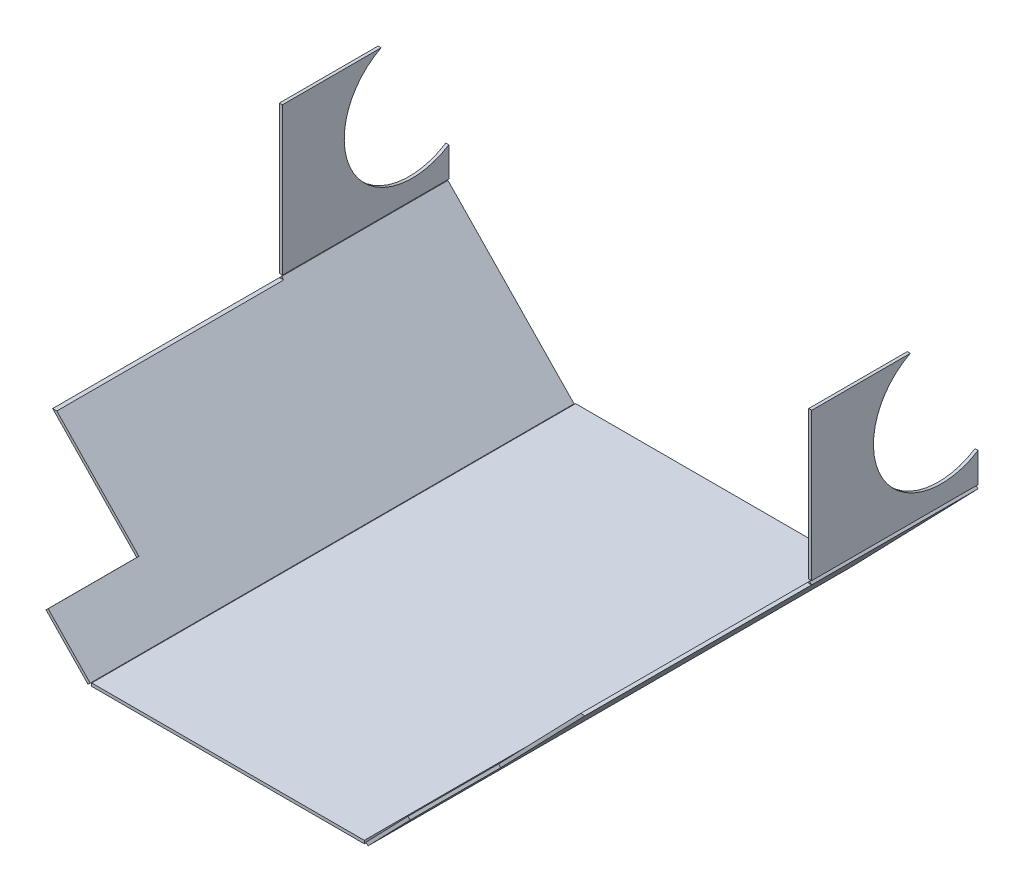
ISO-10303-21;
HEADER;
FILE_DESCRIPTION(('STEP AP214'),'2;1');
FILE_NAME('part.step','',(''),(''),'','','');
FILE_SCHEMA(('AUTOMOTIVE_DESIGN { 1 0 10303 214 1 1 1 1 }'));
ENDSEC;
DATA;
#1=APPLICATION_CONTEXT('core data for automotive mechanical design processes');
#2=APPLICATION_PROTOCOL_DEFINITION('international standard','automotive_design',2000,#1);
#3=PRODUCT_CONTEXT('',#1,'mechanical');
#4=PRODUCT('Part','Part','',(#3));
#5=PRODUCT_RELATED_PRODUCT_CATEGORY('part','',(#4));
#6=PRODUCT_DEFINITION_FORMATION('','',#4);
#7=PRODUCT_DEFINITION_CONTEXT('part definition',#1,'design');
#8=PRODUCT_DEFINITION('design','',#6,#7);
#9=PRODUCT_DEFINITION_SHAPE('','',#8);
#10=(LENGTH_UNIT() NAMED_UNIT(*) SI_UNIT(.MILLI.,.METRE.));
#11=(NAMED_UNIT(*) PLANE_ANGLE_UNIT() SI_UNIT($,.RADIAN.));
#12=(NAMED_UNIT(*) SI_UNIT($,.STERADIAN.) SOLID_ANGLE_UNIT());
#13=UNCERTAINTY_MEASURE_WITH_UNIT(LENGTH_MEASURE(1.E-05),#10,'distance_accuracy_value','');
#14=(GEOMETRIC_REPRESENTATION_CONTEXT(3) GLOBAL_UNCERTAINTY_ASSIGNED_CONTEXT((#13)) GLOBAL_UNIT_ASSIGNED_CONTEXT((#10,
#11,#12)) REPRESENTATION_CONTEXT('',''));
#15=CARTESIAN_POINT('',(0.,0.,0.));
#16=DIRECTION('',(0.,0.,1.));
#17=DIRECTION('',(1.,0.,0.));
#18=AXIS2_PLACEMENT_3D('',#15,#16,#17);
#19=CARTESIAN_POINT('',(0.,0.,0.));
#20=DIRECTION('',(0.,0.,1.));
#21=DIRECTION('',(1.,0.,0.));
#22=AXIS2_PLACEMENT_3D('',#19,#20,#21);
#23=PLANE('',#22);
#24=DIRECTION('',(0.,-1.,0.));
#25=VECTOR('',#24,1.);
#26=CARTESIAN_POINT('',(174.,100.,0.));
#27=LINE('',#26,#25);
#28=CARTESIAN_POINT('',(174.,22.0292546820582,0.));
#29=VERTEX_POINT('',#28);
#30=CARTESIAN_POINT('',(174.,2.39051798994287,0.));
#31=VERTEX_POINT('',#30);
#32=EDGE_CURVE('E103',#29,#31,#27,.T.);
#33=ORIENTED_EDGE('',*,*,#32,.F.);
#34=DIRECTION('',(1.,0.,0.));
#35=VECTOR('',#34,1.);
#36=CARTESIAN_POINT('',(-176.,22.029254682058,0.));
#37=LINE('',#36,#35);
#38=CARTESIAN_POINT('',(176.,22.0292546820582,0.));
#39=VERTEX_POINT('',#38);
#40=EDGE_CURVE('E93',#29,#39,#37,.T.);
#41=ORIENTED_EDGE('',*,*,#40,.T.);
#42=DIRECTION('',(0.,1.,0.));
#43=VECTOR('',#42,1.);
#44=CARTESIAN_POINT('',(176.,100.,0.));
#45=LINE('',#44,#43);
#46=CARTESIAN_POINT('',(176.,2.39051798994287,0.));
#47=VERTEX_POINT('',#46);
#48=EDGE_CURVE('E102',#47,#39,#45,.T.);
#49=ORIENTED_EDGE('',*,*,#48,.F.);
#50=DIRECTION('',(1.,0.,0.));
#51=VECTOR('',#50,1.);
#52=CARTESIAN_POINT('',(176.,2.39051798994287,0.));
#53=LINE('',#52,#51);
#54=EDGE_CURVE('E111',#31,#47,#53,.T.);
#55=ORIENTED_EDGE('',*,*,#54,.F.);
#56=EDGE_LOOP('',(#33,#41,#49,#55));
#57=FACE_BOUND('',#56,.T.);
#58=ADVANCED_FACE('F51',(#57),#23,.F.);
#59=CARTESIAN_POINT('',(176.,100.,320.));
#60=DIRECTION('',(0.,-1.,0.));
#61=DIRECTION('',(0.,0.,-1.));
#62=AXIS2_PLACEMENT_3D('',#59,#60,#61);
#63=PLANE('',#62);
#64=DIRECTION('',(0.,0.,-1.));
#65=VECTOR('',#64,1.);
#66=CARTESIAN_POINT('',(176.,100.,320.));
#67=LINE('',#66,#65);
#68=CARTESIAN_POINT('',(176.,100.,110.));
#69=VERTEX_POINT('',#68);
#70=CARTESIAN_POINT('',(176.,100.,44.7655281280883));
#71=VERTEX_POINT('',#70);
#72=EDGE_CURVE('E104',#69,#71,#67,.T.);
#73=ORIENTED_EDGE('',*,*,#72,.T.);
#74=DIRECTION('',(1.,0.,0.));
#75=VECTOR('',#74,1.);
#76=CARTESIAN_POINT('',(-176.,100.,44.7655281280879));
#77=LINE('',#76,#75);
#78=CARTESIAN_POINT('',(174.,100.,44.7655281280883));
#79=VERTEX_POINT('',#78);
#80=EDGE_CURVE('E65',#71,#79,#77,.F.);
#81=ORIENTED_EDGE('',*,*,#80,.T.);
#82=DIRECTION('',(0.,0.,-1.));
#83=VECTOR('',#82,1.);
#84=CARTESIAN_POINT('',(174.,100.,320.));
#85=LINE('',#84,#83);
#86=CARTESIAN_POINT('',(174.,100.,110.));
#87=VERTEX_POINT('',#86);
#88=EDGE_CURVE('E120',#87,#79,#85,.T.);
#89=ORIENTED_EDGE('',*,*,#88,.F.);
#90=DIRECTION('',(1.,0.,0.));
#91=VECTOR('',#90,1.);
#92=CARTESIAN_POINT('',(-176.,100.,110.));
#93=LINE('',#92,#91);
#94=EDGE_CURVE('E122',#87,#69,#93,.T.);
#95=ORIENTED_EDGE('',*,*,#94,.T.);
#96=EDGE_LOOP('',(#73,#81,#89,#95));
#97=FACE_BOUND('',#96,.T.);
#98=ADVANCED_FACE('F138',(#97),#63,.F.);
#99=CARTESIAN_POINT('',(174.,100.,320.));
#100=DIRECTION('',(1.,0.,0.));
#101=DIRECTION('',(0.,0.,-1.));
#102=AXIS2_PLACEMENT_3D('',#99,#100,#101);
#103=PLANE('',#102);
#104=ORIENTED_EDGE('',*,*,#88,.T.);
#105=CARTESIAN_POINT('',(174.,60.,24.15));
#106=DIRECTION('',(1.,0.,0.));
#107=DIRECTION('',(0.,0.,-1.));
#108=AXIS2_PLACEMENT_3D('',#105,#106,#107);
#109=CIRCLE('',#108,45.);
#110=EDGE_CURVE('E71',#79,#29,#109,.T.);
#111=ORIENTED_EDGE('',*,*,#110,.T.);
#112=ORIENTED_EDGE('',*,*,#32,.T.);
#113=DIRECTION('',(0.,0.,-1.));
#114=VECTOR('',#113,1.);
#115=CARTESIAN_POINT('',(174.,2.39051798994287,320.));
#116=LINE('',#115,#114);
#117=CARTESIAN_POINT('',(174.,2.39051798994287,110.));
#118=VERTEX_POINT('',#117);
#119=EDGE_CURVE('E114',#118,#31,#116,.T.);
#120=ORIENTED_EDGE('',*,*,#119,.F.);
#121=DIRECTION('',(0.,1.,0.));
#122=VECTOR('',#121,1.);
#123=CARTESIAN_POINT('',(174.,99.9999999999999,110.));
#124=LINE('',#123,#122);
#125=EDGE_CURVE('E124',#118,#87,#124,.T.);
#126=ORIENTED_EDGE('',*,*,#125,.T.);
#127=EDGE_LOOP('',(#104,#111,#112,#120,#126));
#128=FACE_BOUND('',#127,.T.);
#129=ADVANCED_FACE('F139',(#128),#103,.F.);
#130=CARTESIAN_POINT('',(176.,2.39051798994287,320.));
#131=DIRECTION('',(0.,1.,0.));
#132=DIRECTION('',(-1.,0.,0.));
#133=AXIS2_PLACEMENT_3D('',#130,#131,#132);
#134=PLANE('',#133);
#135=DIRECTION('',(0.,0.,-1.));
#136=VECTOR('',#135,1.);
#137=CARTESIAN_POINT('',(176.,2.39051798994287,320.));
#138=LINE('',#137,#136);
#139=CARTESIAN_POINT('',(176.,2.39051798994287,110.));
#140=VERTEX_POINT('',#139);
#141=EDGE_CURVE('E109',#140,#47,#138,.T.);
#142=ORIENTED_EDGE('',*,*,#141,.F.);
#143=DIRECTION('',(-1.,0.,0.));
#144=VECTOR('',#143,1.);
#145=CARTESIAN_POINT('',(176.,2.39051798994287,110.));
#146=LINE('',#145,#144);
#147=EDGE_CURVE('E128',#140,#118,#146,.T.);
#148=ORIENTED_EDGE('',*,*,#147,.T.);
#149=ORIENTED_EDGE('',*,*,#119,.T.);
#150=ORIENTED_EDGE('',*,*,#54,.T.);
#151=EDGE_LOOP('',(#142,#148,#149,#150));
#152=FACE_BOUND('',#151,.T.);
#153=ADVANCED_FACE('F141',(#152),#134,.F.);
#154=CARTESIAN_POINT('',(176.,100.,320.));
#155=DIRECTION('',(-1.,0.,0.));
#156=DIRECTION('',(0.,-1.,0.));
#157=AXIS2_PLACEMENT_3D('',#154,#155,#156);
#158=PLANE('',#157);
#159=ORIENTED_EDGE('',*,*,#48,.T.);
#160=CARTESIAN_POINT('',(176.,60.,24.15));
#161=DIRECTION('',(1.,0.,0.));
#162=DIRECTION('',(0.,1.,0.));
#163=AXIS2_PLACEMENT_3D('',#160,#161,#162);
#164=CIRCLE('',#163,45.);
#165=EDGE_CURVE('E12',#71,#39,#164,.T.);
#166=ORIENTED_EDGE('',*,*,#165,.F.);
#167=ORIENTED_EDGE('',*,*,#72,.F.);
#168=DIRECTION('',(0.,1.,0.));
#169=VECTOR('',#168,1.);
#170=CARTESIAN_POINT('',(176.,100.,110.));
#171=LINE('',#170,#169);
#172=EDGE_CURVE('E59',#140,#69,#171,.T.);
#173=ORIENTED_EDGE('',*,*,#172,.F.);
#174=ORIENTED_EDGE('',*,*,#141,.T.);
#175=EDGE_LOOP('',(#159,#166,#167,#173,#174));
#176=FACE_BOUND('',#175,.T.);
#177=ADVANCED_FACE('F106',(#176),#158,.F.);
#178=CARTESIAN_POINT('',(-176.,100.,110.));
#179=DIRECTION('',(0.,0.,-1.));
#180=DIRECTION('',(0.,1.,0.));
#181=AXIS2_PLACEMENT_3D('',#178,#179,#180);
#182=PLANE('',#181);
#183=ORIENTED_EDGE('',*,*,#147,.F.);
#184=ORIENTED_EDGE('',*,*,#172,.T.);
#185=ORIENTED_EDGE('',*,*,#94,.F.);
#186=ORIENTED_EDGE('',*,*,#125,.F.);
#187=EDGE_LOOP('',(#183,#184,#185,#186));
#188=FACE_BOUND('',#187,.T.);
#189=ADVANCED_FACE('F153',(#188),#182,.F.);
#190=CARTESIAN_POINT('',(-176.,59.9999999999998,24.15));
#191=DIRECTION('',(1.,0.,0.));
#192=DIRECTION('',(0.,1.,0.));
#193=AXIS2_PLACEMENT_3D('',#190,#191,#192);
#194=CYLINDRICAL_SURFACE('',#193,45.);
#195=ORIENTED_EDGE('',*,*,#165,.T.);
#196=ORIENTED_EDGE('',*,*,#40,.F.);
#197=ORIENTED_EDGE('',*,*,#110,.F.);
#198=ORIENTED_EDGE('',*,*,#80,.F.);
#199=EDGE_LOOP('',(#195,#196,#197,#198));
#200=FACE_BOUND('',#199,.T.);
#201=ADVANCED_FACE('F53',(#200),#194,.F.);
#202=CLOSED_SHELL('',(#58,#98,#129,#153,#177,#189,#201));
#203=MANIFOLD_SOLID_BREP('B2',#202);
#204=CARTESIAN_POINT('',(-176.,100.,320.));
#205=DIRECTION('',(1.,0.,0.));
#206=DIRECTION('',(0.,0.,-1.));
#207=AXIS2_PLACEMENT_3D('',#204,#205,#206);
#208=PLANE('',#207);
#209=DIRECTION('',(0.,0.,-1.));
#210=VECTOR('',#209,1.);
#211=CARTESIAN_POINT('',(-176.,100.,320.));
#212=LINE('',#211,#210);
#213=CARTESIAN_POINT('',(-176.,100.,110.));
#214=VERTEX_POINT('',#213);
#215=CARTESIAN_POINT('',(-176.,100.,44.7655281280879));
#216=VERTEX_POINT('',#215);
#217=EDGE_CURVE('E291',#214,#216,#212,.T.);
#218=ORIENTED_EDGE('',*,*,#217,.T.);
#219=CARTESIAN_POINT('',(-176.,59.9999999999998,24.15));
#220=DIRECTION('',(1.,0.,0.));
#221=DIRECTION('',(0.,1.,0.));
#222=AXIS2_PLACEMENT_3D('',#219,#220,#221);
#223=CIRCLE('',#222,45.);
#224=CARTESIAN_POINT('',(-176.,22.029254682058,0.));
#225=VERTEX_POINT('',#224);
#226=EDGE_CURVE('E235',#216,#225,#223,.T.);
#227=ORIENTED_EDGE('',*,*,#226,.T.);
#228=DIRECTION('',(0.,-1.,0.));
#229=VECTOR('',#228,1.);
#230=CARTESIAN_POINT('',(-176.,100.,0.));
#231=LINE('',#230,#229);
#232=CARTESIAN_POINT('',(-176.,2.39051798994287,0.));
#233=VERTEX_POINT('',#232);
#234=EDGE_CURVE('E295',#225,#233,#231,.T.);
#235=ORIENTED_EDGE('',*,*,#234,.T.);
#236=DIRECTION('',(0.,0.,-1.));
#237=VECTOR('',#236,1.);
#238=CARTESIAN_POINT('',(-176.,2.39051798994287,320.));
#239=LINE('',#238,#237);
#240=CARTESIAN_POINT('',(-176.,2.3905179899429,110.));
#241=VERTEX_POINT('',#240);
#242=EDGE_CURVE('E293',#241,#233,#239,.T.);
#243=ORIENTED_EDGE('',*,*,#242,.F.);
#244=DIRECTION('',(0.,1.,0.));
#245=VECTOR('',#244,1.);
#246=CARTESIAN_POINT('',(-176.,100.,110.));
#247=LINE('',#246,#245);
#248=EDGE_CURVE('E277',#241,#214,#247,.T.);
#249=ORIENTED_EDGE('',*,*,#248,.T.);
#250=EDGE_LOOP('',(#218,#227,#235,#243,#249));
#251=FACE_BOUND('',#250,.T.);
#252=ADVANCED_FACE('F231',(#251),#208,.F.);
#253=CARTESIAN_POINT('',(-174.,2.39051798994287,320.));
#254=DIRECTION('',(0.,1.,0.));
#255=DIRECTION('',(-1.,0.,0.));
#256=AXIS2_PLACEMENT_3D('',#253,#254,#255);
#257=PLANE('',#256);
#258=DIRECTION('',(0.,0.,-1.));
#259=VECTOR('',#258,1.);
#260=CARTESIAN_POINT('',(-174.,2.39051798994287,320.));
#261=LINE('',#260,#259);
#262=CARTESIAN_POINT('',(-174.,2.39051798994287,110.));
#263=VERTEX_POINT('',#262);
#264=CARTESIAN_POINT('',(-174.,2.39051798994287,0.));
#265=VERTEX_POINT('',#264);
#266=EDGE_CURVE('E308',#263,#265,#261,.T.);
#267=ORIENTED_EDGE('',*,*,#266,.F.);
#268=DIRECTION('',(-1.,0.,0.));
#269=VECTOR('',#268,1.);
#270=CARTESIAN_POINT('',(-174.,2.39051798994287,110.));
#271=LINE('',#270,#269);
#272=EDGE_CURVE('E294',#263,#241,#271,.T.);
#273=ORIENTED_EDGE('',*,*,#272,.T.);
#274=ORIENTED_EDGE('',*,*,#242,.T.);
#275=DIRECTION('',(1.,0.,0.));
#276=VECTOR('',#275,1.);
#277=CARTESIAN_POINT('',(-174.,2.39051798994287,0.));
#278=LINE('',#277,#276);
#279=EDGE_CURVE('E306',#233,#265,#278,.T.);
#280=ORIENTED_EDGE('',*,*,#279,.T.);
#281=EDGE_LOOP('',(#267,#273,#274,#280));
#282=FACE_BOUND('',#281,.T.);
#283=ADVANCED_FACE('F317',(#282),#257,.F.);
#284=CARTESIAN_POINT('',(-174.,100.,320.));
#285=DIRECTION('',(-1.,0.,0.));
#286=DIRECTION('',(0.,0.,1.));
#287=AXIS2_PLACEMENT_3D('',#284,#285,#286);
#288=PLANE('',#287);
#289=DIRECTION('',(0.,1.,0.));
#290=VECTOR('',#289,1.);
#291=CARTESIAN_POINT('',(-174.,100.,0.));
#292=LINE('',#291,#290);
#293=CARTESIAN_POINT('',(-174.,22.029254682058,0.));
#294=VERTEX_POINT('',#293);
#295=EDGE_CURVE('E303',#265,#294,#292,.T.);
#296=ORIENTED_EDGE('',*,*,#295,.T.);
#297=CARTESIAN_POINT('',(-174.,59.9999999999998,24.15));
#298=DIRECTION('',(-1.,0.,0.));
#299=DIRECTION('',(0.,0.,1.));
#300=AXIS2_PLACEMENT_3D('',#297,#298,#299);
#301=CIRCLE('',#300,45.);
#302=CARTESIAN_POINT('',(-174.,100.,44.7655281280879));
#303=VERTEX_POINT('',#302);
#304=EDGE_CURVE('E260',#294,#303,#301,.T.);
#305=ORIENTED_EDGE('',*,*,#304,.T.);
#306=DIRECTION('',(0.,0.,-1.));
#307=VECTOR('',#306,1.);
#308=CARTESIAN_POINT('',(-174.,100.,320.));
#309=LINE('',#308,#307);
#310=CARTESIAN_POINT('',(-174.,100.,110.));
#311=VERTEX_POINT('',#310);
#312=EDGE_CURVE('E301',#311,#303,#309,.T.);
#313=ORIENTED_EDGE('',*,*,#312,.F.);
#314=DIRECTION('',(0.,-1.,0.));
#315=VECTOR('',#314,1.);
#316=CARTESIAN_POINT('',(-174.,99.9999999999999,110.));
#317=LINE('',#316,#315);
#318=EDGE_CURVE('E282',#311,#263,#317,.T.);
#319=ORIENTED_EDGE('',*,*,#318,.T.);
#320=ORIENTED_EDGE('',*,*,#266,.T.);
#321=EDGE_LOOP('',(#296,#305,#313,#319,#320));
#322=FACE_BOUND('',#321,.T.);
#323=ADVANCED_FACE('F314',(#322),#288,.F.);
#324=CARTESIAN_POINT('',(-176.,100.,320.));
#325=DIRECTION('',(0.,-1.,0.));
#326=DIRECTION('',(0.,0.,-1.));
#327=AXIS2_PLACEMENT_3D('',#324,#325,#326);
#328=PLANE('',#327);
#329=ORIENTED_EDGE('',*,*,#312,.T.);
#330=DIRECTION('',(1.,0.,0.));
#331=VECTOR('',#330,1.);
#332=CARTESIAN_POINT('',(-176.,100.,44.7655281280879));
#333=LINE('',#332,#331);
#334=EDGE_CURVE('E249',#303,#216,#333,.F.);
#335=ORIENTED_EDGE('',*,*,#334,.T.);
#336=ORIENTED_EDGE('',*,*,#217,.F.);
#337=DIRECTION('',(1.,0.,0.));
#338=VECTOR('',#337,1.);
#339=CARTESIAN_POINT('',(-176.,100.,110.));
#340=LINE('',#339,#338);
#341=EDGE_CURVE('E241',#214,#311,#340,.T.);
#342=ORIENTED_EDGE('',*,*,#341,.T.);
#343=EDGE_LOOP('',(#329,#335,#336,#342));
#344=FACE_BOUND('',#343,.T.);
#345=ADVANCED_FACE('F297',(#344),#328,.F.);
#346=CARTESIAN_POINT('',(0.,0.,0.));
#347=DIRECTION('',(0.,0.,-1.));
#348=DIRECTION('',(-1.,0.,0.));
#349=AXIS2_PLACEMENT_3D('',#346,#347,#348);
#350=PLANE('',#349);
#351=DIRECTION('',(1.,0.,0.));
#352=VECTOR('',#351,1.);
#353=CARTESIAN_POINT('',(-176.,22.029254682058,0.));
#354=LINE('',#353,#352);
#355=EDGE_CURVE('E49',#294,#225,#354,.F.);
#356=ORIENTED_EDGE('',*,*,#355,.F.);
#357=ORIENTED_EDGE('',*,*,#295,.F.);
#358=ORIENTED_EDGE('',*,*,#279,.F.);
#359=ORIENTED_EDGE('',*,*,#234,.F.);
#360=EDGE_LOOP('',(#356,#357,#358,#359));
#361=FACE_BOUND('',#360,.T.);
#362=ADVANCED_FACE('F322',(#361),#350,.T.);
#363=CARTESIAN_POINT('',(-176.,100.,110.));
#364=DIRECTION('',(0.,0.,-1.));
#365=DIRECTION('',(0.,1.,0.));
#366=AXIS2_PLACEMENT_3D('',#363,#364,#365);
#367=PLANE('',#366);
#368=ORIENTED_EDGE('',*,*,#318,.F.);
#369=ORIENTED_EDGE('',*,*,#341,.F.);
#370=ORIENTED_EDGE('',*,*,#248,.F.);
#371=ORIENTED_EDGE('',*,*,#272,.F.);
#372=EDGE_LOOP('',(#368,#369,#370,#371));
#373=FACE_BOUND('',#372,.T.);
#374=ADVANCED_FACE('F280',(#373),#367,.F.);
#375=CARTESIAN_POINT('',(-176.,59.9999999999998,24.15));
#376=DIRECTION('',(1.,0.,0.));
#377=DIRECTION('',(0.,1.,0.));
#378=AXIS2_PLACEMENT_3D('',#375,#376,#377);
#379=CYLINDRICAL_SURFACE('',#378,45.);
#380=ORIENTED_EDGE('',*,*,#304,.F.);
#381=ORIENTED_EDGE('',*,*,#355,.T.);
#382=ORIENTED_EDGE('',*,*,#226,.F.);
#383=ORIENTED_EDGE('',*,*,#334,.F.);
#384=EDGE_LOOP('',(#380,#381,#382,#383));
#385=FACE_BOUND('',#384,.T.);
#386=ADVANCED_FACE('F233',(#385),#379,.F.);
#387=CLOSED_SHELL('',(#252,#283,#323,#345,#362,#374,#386));
#388=MANIFOLD_SOLID_BREP('B6',#387);
#389=CARTESIAN_POINT('',(92.57,-86.25,320.));
#390=DIRECTION('',(0.695258994971437,0.718759299008582,0.));
#391=DIRECTION('',(-0.718759299008582,0.695258994971437,0.));
#392=AXIS2_PLACEMENT_3D('',#389,#390,#391);
#393=PLANE('',#392);
#394=DIRECTION('',(0.718759299008582,-0.695258994971437,0.));
#395=VECTOR('',#394,1.);
#396=CARTESIAN_POINT('',(92.57,-86.25,0.));
#397=LINE('',#396,#395);
#398=CARTESIAN_POINT('',(91.1324814019829,-84.8594820100571,0.));
#399=VERTEX_POINT('',#398);
#400=CARTESIAN_POINT('',(92.57,-86.25,0.));
#401=VERTEX_POINT('',#400);
#402=EDGE_CURVE('E507',#399,#401,#397,.T.);
#403=ORIENTED_EDGE('',*,*,#402,.T.);
#404=DIRECTION('',(0.,0.,-1.));
#405=VECTOR('',#404,1.);
#406=CARTESIAN_POINT('',(92.57,-86.25,320.));
#407=LINE('',#406,#405);
#408=CARTESIAN_POINT('',(92.57,-86.25,320.));
#409=VERTEX_POINT('',#408);
#410=EDGE_CURVE('E524',#409,#401,#407,.T.);
#411=ORIENTED_EDGE('',*,*,#410,.F.);
#412=DIRECTION('',(0.718759299008582,-0.695258994971437,0.));
#413=VECTOR('',#412,1.);
#414=CARTESIAN_POINT('',(92.57,-86.25,320.));
#415=LINE('',#414,#413);
#416=CARTESIAN_POINT('',(91.1324814019829,-84.8594820100571,320.));
#417=VERTEX_POINT('',#416);
#418=EDGE_CURVE('E498',#417,#409,#415,.T.);
#419=ORIENTED_EDGE('',*,*,#418,.F.);
#420=DIRECTION('',(0.,0.,-1.));
#421=VECTOR('',#420,1.);
#422=CARTESIAN_POINT('',(91.1324814019829,-84.8594820100571,320.));
#423=LINE('',#422,#421);
#424=EDGE_CURVE('E503',#417,#399,#423,.T.);
#425=ORIENTED_EDGE('',*,*,#424,.T.);
#426=EDGE_LOOP('',(#403,#411,#419,#425));
#427=FACE_BOUND('',#426,.T.);
#428=ADVANCED_FACE('F411',(#427),#393,.F.);
#429=CARTESIAN_POINT('',(92.57,-86.25,320.));
#430=DIRECTION('',(-0.718759299008584,0.695258994971434,0.));
#431=DIRECTION('',(-0.695258994971434,-0.718759299008584,0.));
#432=AXIS2_PLACEMENT_3D('',#429,#430,#431);
#433=PLANE('',#432);
#434=DIRECTION('',(0.,0.,-1.));
#435=VECTOR('',#434,1.);
#436=CARTESIAN_POINT('',(176.,0.,320.));
#437=LINE('',#436,#435);
#438=CARTESIAN_POINT('',(176.,0.,260.));
#439=VERTEX_POINT('',#438);
#440=CARTESIAN_POINT('',(176.,0.,110.));
#441=VERTEX_POINT('',#440);
#442=EDGE_CURVE('E521',#439,#441,#437,.T.);
#443=ORIENTED_EDGE('',*,*,#442,.F.);
#444=DIRECTION('',(0.695258994971434,0.718759299008584,0.));
#445=VECTOR('',#444,1.);
#446=CARTESIAN_POINT('',(176.,0.,260.));
#447=LINE('',#446,#445);
#448=CARTESIAN_POINT('',(120.379280402285,-57.5007439206868,260.));
#449=VERTEX_POINT('',#448);
#450=EDGE_CURVE('E426',#449,#439,#447,.T.);
#451=ORIENTED_EDGE('',*,*,#450,.F.);
#452=DIRECTION('',(0.,0.,-1.));
#453=VECTOR('',#452,1.);
#454=CARTESIAN_POINT('',(120.379280402285,-57.5007439206868,320.));
#455=LINE('',#454,#453);
#456=CARTESIAN_POINT('',(120.379280402285,-57.5007439206868,320.));
#457=VERTEX_POINT('',#456);
#458=EDGE_CURVE('E487',#457,#449,#455,.T.);
#459=ORIENTED_EDGE('',*,*,#458,.F.);
#460=DIRECTION('',(0.695258994971434,0.718759299008584,0.));
#461=VECTOR('',#460,1.);
#462=CARTESIAN_POINT('',(92.57,-86.25,320.));
#463=LINE('',#462,#461);
#464=EDGE_CURVE('E450',#409,#457,#463,.T.);
#465=ORIENTED_EDGE('',*,*,#464,.F.);
#466=ORIENTED_EDGE('',*,*,#410,.T.);
#467=DIRECTION('',(0.695258994971434,0.718759299008584,0.));
#468=VECTOR('',#467,1.);
#469=CARTESIAN_POINT('',(92.57,-86.25,0.));
#470=LINE('',#469,#468);
#471=CARTESIAN_POINT('',(176.,0.,0.));
#472=VERTEX_POINT('',#471);
#473=EDGE_CURVE('E434',#401,#472,#470,.T.);
#474=ORIENTED_EDGE('',*,*,#473,.T.);
#475=EDGE_CURVE('E523',#441,#472,#437,.T.);
#476=ORIENTED_EDGE('',*,*,#475,.F.);
#477=EDGE_LOOP('',(#443,#451,#459,#465,#466,#474,#476));
#478=FACE_BOUND('',#477,.T.);
#479=ADVANCED_FACE('F495',(#478),#433,.F.);
#480=CARTESIAN_POINT('',(176.,0.,320.));
#481=DIRECTION('',(-0.695258994971433,-0.718759299008586,0.));
#482=DIRECTION('',(0.718759299008586,-0.695258994971433,0.));
#483=AXIS2_PLACEMENT_3D('',#480,#481,#482);
#484=PLANE('',#483);
#485=DIRECTION('',(0.,0.,-1.));
#486=VECTOR('',#485,1.);
#487=CARTESIAN_POINT('',(174.562481401983,1.39051798994287,320.));
#488=LINE('',#487,#486);
#489=CARTESIAN_POINT('',(174.562481401983,1.39051798994287,110.));
#490=VERTEX_POINT('',#489);
#491=CARTESIAN_POINT('',(174.562481401983,1.39051798994287,0.));
#492=VERTEX_POINT('',#491);
#493=EDGE_CURVE('E519',#490,#492,#488,.T.);
#494=ORIENTED_EDGE('',*,*,#493,.F.);
#495=DIRECTION('',(0.718759299008586,-0.695258994971433,0.));
#496=VECTOR('',#495,1.);
#497=CARTESIAN_POINT('',(176.,0.,110.));
#498=LINE('',#497,#496);
#499=EDGE_CURVE('E526',#490,#441,#498,.T.);
#500=ORIENTED_EDGE('',*,*,#499,.T.);
#501=ORIENTED_EDGE('',*,*,#475,.T.);
#502=DIRECTION('',(-0.718759299008586,0.695258994971433,0.));
#503=VECTOR('',#502,1.);
#504=CARTESIAN_POINT('',(176.,0.,0.));
#505=LINE('',#504,#503);
#506=EDGE_CURVE('E512',#472,#492,#505,.T.);
#507=ORIENTED_EDGE('',*,*,#506,.T.);
#508=EDGE_LOOP('',(#494,#500,#501,#507));
#509=FACE_BOUND('',#508,.T.);
#510=ADVANCED_FACE('F545',(#509),#484,.F.);
#511=CARTESIAN_POINT('',(91.1324814019829,-84.8594820100571,320.));
#512=DIRECTION('',(0.718759299008584,-0.695258994971434,0.));
#513=DIRECTION('',(0.695258994971434,0.718759299008584,0.));
#514=AXIS2_PLACEMENT_3D('',#511,#512,#513);
#515=PLANE('',#514);
#516=DIRECTION('',(0.,0.,-1.));
#517=VECTOR('',#516,1.);
#518=CARTESIAN_POINT('',(118.941761804268,-56.1102259307439,320.));
#519=LINE('',#518,#517);
#520=CARTESIAN_POINT('',(118.941761804268,-56.1102259307439,320.));
#521=VERTEX_POINT('',#520);
#522=CARTESIAN_POINT('',(118.941761804268,-56.1102259307439,260.));
#523=VERTEX_POINT('',#522);
#524=EDGE_CURVE('E489',#521,#523,#519,.T.);
#525=ORIENTED_EDGE('',*,*,#524,.T.);
#526=DIRECTION('',(0.695258994971434,0.718759299008584,0.));
#527=VECTOR('',#526,1.);
#528=CARTESIAN_POINT('',(91.1324814019829,-84.8594820100571,260.));
#529=LINE('',#528,#527);
#530=CARTESIAN_POINT('',(173.217427304581,0.,260.));
#531=VERTEX_POINT('',#530);
#532=EDGE_CURVE('E535',#523,#531,#529,.T.);
#533=ORIENTED_EDGE('',*,*,#532,.T.);
#534=DIRECTION('',(0.,0.,-1.));
#535=VECTOR('',#534,1.);
#536=CARTESIAN_POINT('',(173.217427304581,0.,320.));
#537=LINE('',#536,#535);
#538=CARTESIAN_POINT('',(173.217427304581,0.,110.));
#539=VERTEX_POINT('',#538);
#540=EDGE_CURVE('E529',#531,#539,#537,.T.);
#541=ORIENTED_EDGE('',*,*,#540,.T.);
#542=DIRECTION('',(0.695258994971434,0.718759299008584,0.));
#543=VECTOR('',#542,1.);
#544=CARTESIAN_POINT('',(91.1324814019829,-84.8594820100571,110.));
#545=LINE('',#544,#543);
#546=EDGE_CURVE('E419',#539,#490,#545,.T.);
#547=ORIENTED_EDGE('',*,*,#546,.T.);
#548=ORIENTED_EDGE('',*,*,#493,.T.);
#549=DIRECTION('',(-0.695258994971434,-0.718759299008584,0.));
#550=VECTOR('',#549,1.);
#551=CARTESIAN_POINT('',(91.1324814019829,-84.8594820100571,0.));
#552=LINE('',#551,#550);
#553=EDGE_CURVE('E458',#492,#399,#552,.T.);
#554=ORIENTED_EDGE('',*,*,#553,.T.);
#555=ORIENTED_EDGE('',*,*,#424,.F.);
#556=DIRECTION('',(-0.695258994971434,-0.718759299008584,0.));
#557=VECTOR('',#556,1.);
#558=CARTESIAN_POINT('',(91.1324814019829,-84.8594820100571,320.));
#559=LINE('',#558,#557);
#560=EDGE_CURVE('E500',#521,#417,#559,.T.);
#561=ORIENTED_EDGE('',*,*,#560,.F.);
#562=EDGE_LOOP('',(#525,#533,#541,#547,#548,#554,#555,#561));
#563=FACE_BOUND('',#562,.T.);
#564=ADVANCED_FACE('F540',(#563),#515,.F.);
#565=CARTESIAN_POINT('',(0.,0.,320.));
#566=DIRECTION('',(0.,0.,-1.));
#567=DIRECTION('',(-1.,0.,0.));
#568=AXIS2_PLACEMENT_3D('',#565,#566,#567);
#569=PLANE('',#568);
#570=ORIENTED_EDGE('',*,*,#464,.T.);
#571=DIRECTION('',(0.718759299008584,-0.695258994971434,0.));
#572=VECTOR('',#571,1.);
#573=CARTESIAN_POINT('',(-111.441561712004,166.740564573171,320.));
#574=LINE('',#573,#572);
#575=EDGE_CURVE('E484',#521,#457,#574,.T.);
#576=ORIENTED_EDGE('',*,*,#575,.F.);
#577=ORIENTED_EDGE('',*,*,#560,.T.);
#578=ORIENTED_EDGE('',*,*,#418,.T.);
#579=EDGE_LOOP('',(#570,#576,#577,#578));
#580=FACE_BOUND('',#579,.T.);
#581=ADVANCED_FACE('F413',(#580),#569,.F.);
#582=CARTESIAN_POINT('',(0.,0.,0.));
#583=DIRECTION('',(0.,0.,-1.));
#584=DIRECTION('',(-1.,0.,0.));
#585=AXIS2_PLACEMENT_3D('',#582,#583,#584);
#586=PLANE('',#585);
#587=ORIENTED_EDGE('',*,*,#402,.F.);
#588=ORIENTED_EDGE('',*,*,#553,.F.);
#589=ORIENTED_EDGE('',*,*,#506,.F.);
#590=ORIENTED_EDGE('',*,*,#473,.F.);
#591=EDGE_LOOP('',(#587,#588,#589,#590));
#592=FACE_BOUND('',#591,.T.);
#593=ADVANCED_FACE('F543',(#592),#586,.T.);
#594=CARTESIAN_POINT('',(-176.,100.,110.));
#595=DIRECTION('',(0.,0.,-1.));
#596=DIRECTION('',(0.,1.,0.));
#597=AXIS2_PLACEMENT_3D('',#594,#595,#596);
#598=PLANE('',#597);
#599=ORIENTED_EDGE('',*,*,#546,.F.);
#600=DIRECTION('',(1.,0.,0.));
#601=VECTOR('',#600,1.);
#602=CARTESIAN_POINT('',(-176.,0.,110.));
#603=LINE('',#602,#601);
#604=EDGE_CURVE('E531',#539,#441,#603,.T.);
#605=ORIENTED_EDGE('',*,*,#604,.T.);
#606=ORIENTED_EDGE('',*,*,#499,.F.);
#607=EDGE_LOOP('',(#599,#605,#606));
#608=FACE_BOUND('',#607,.T.);
#609=ADVANCED_FACE('F547',(#608),#598,.F.);
#610=CARTESIAN_POINT('',(-176.,0.,110.));
#611=DIRECTION('',(0.,-1.,0.));
#612=DIRECTION('',(0.,0.,-1.));
#613=AXIS2_PLACEMENT_3D('',#610,#611,#612);
#614=PLANE('',#613);
#615=ORIENTED_EDGE('',*,*,#540,.F.);
#616=DIRECTION('',(1.,0.,0.));
#617=VECTOR('',#616,1.);
#618=CARTESIAN_POINT('',(-176.,0.,260.));
#619=LINE('',#618,#617);
#620=EDGE_CURVE('E229',#531,#439,#619,.T.);
#621=ORIENTED_EDGE('',*,*,#620,.T.);
#622=ORIENTED_EDGE('',*,*,#442,.T.);
#623=ORIENTED_EDGE('',*,*,#604,.F.);
#624=EDGE_LOOP('',(#615,#621,#622,#623));
#625=FACE_BOUND('',#624,.T.);
#626=ADVANCED_FACE('F550',(#625),#614,.F.);
#627=CARTESIAN_POINT('',(-111.441561712004,166.740564573171,320.));
#628=DIRECTION('',(-0.695258994971434,-0.718759299008584,0.));
#629=DIRECTION('',(0.718759299008584,-0.695258994971434,0.));
#630=AXIS2_PLACEMENT_3D('',#627,#628,#629);
#631=PLANE('',#630);
#632=ORIENTED_EDGE('',*,*,#575,.T.);
#633=ORIENTED_EDGE('',*,*,#458,.T.);
#634=DIRECTION('',(0.718759299008584,-0.695258994971434,0.));
#635=VECTOR('',#634,1.);
#636=CARTESIAN_POINT('',(-111.441561712004,166.740564573171,260.));
#637=LINE('',#636,#635);
#638=EDGE_CURVE('E492',#523,#449,#637,.T.);
#639=ORIENTED_EDGE('',*,*,#638,.F.);
#640=ORIENTED_EDGE('',*,*,#524,.F.);
#641=EDGE_LOOP('',(#632,#633,#639,#640));
#642=FACE_BOUND('',#641,.T.);
#643=ADVANCED_FACE('F485',(#642),#631,.F.);
#644=CARTESIAN_POINT('',(-55.8208421142896,224.241308493857,260.));
#645=DIRECTION('',(0.,0.,-1.));
#646=DIRECTION('',(-1.,0.,0.));
#647=AXIS2_PLACEMENT_3D('',#644,#645,#646);
#648=PLANE('',#647);
#649=ORIENTED_EDGE('',*,*,#638,.T.);
#650=ORIENTED_EDGE('',*,*,#450,.T.);
#651=ORIENTED_EDGE('',*,*,#620,.F.);
#652=ORIENTED_EDGE('',*,*,#532,.F.);
#653=EDGE_LOOP('',(#649,#650,#651,#652));
#654=FACE_BOUND('',#653,.T.);
#655=ADVANCED_FACE('F539',(#654),#648,.F.);
#656=CLOSED_SHELL('',(#428,#479,#510,#564,#581,#593,#609,#626,#643,#655));
#657=MANIFOLD_SOLID_BREP('B43',#656);
#658=CARTESIAN_POINT('',(-92.57,-86.25,320.));
#659=DIRECTION('',(-0.695258994971433,0.718759299008585,0.));
#660=DIRECTION('',(-0.718759299008585,-0.695258994971433,0.));
#661=AXIS2_PLACEMENT_3D('',#658,#659,#660);
#662=PLANE('',#661);
#663=DIRECTION('',(0.718759299008585,0.695258994971433,0.));
#664=VECTOR('',#663,1.);
#665=CARTESIAN_POINT('',(-92.57,-86.25,0.));
#666=LINE('',#665,#664);
#667=CARTESIAN_POINT('',(-92.57,-86.25,0.));
#668=VERTEX_POINT('',#667);
#669=CARTESIAN_POINT('',(-91.1324814019829,-84.8594820100571,0.));
#670=VERTEX_POINT('',#669);
#671=EDGE_CURVE('E678',#668,#670,#666,.T.);
#672=ORIENTED_EDGE('',*,*,#671,.T.);
#673=DIRECTION('',(0.,0.,-1.));
#674=VECTOR('',#673,1.);
#675=CARTESIAN_POINT('',(-91.1324814019829,-84.8594820100571,320.));
#676=LINE('',#675,#674);
#677=CARTESIAN_POINT('',(-91.1324814019829,-84.8594820100571,320.));
#678=VERTEX_POINT('',#677);
#679=EDGE_CURVE('E775',#678,#670,#676,.T.);
#680=ORIENTED_EDGE('',*,*,#679,.F.);
#681=DIRECTION('',(0.718759299008585,0.695258994971433,0.));
#682=VECTOR('',#681,1.);
#683=CARTESIAN_POINT('',(-92.57,-86.25,320.));
#684=LINE('',#683,#682);
#685=CARTESIAN_POINT('',(-92.57,-86.25,320.));
#686=VERTEX_POINT('',#685);
#687=EDGE_CURVE('E786',#686,#678,#684,.T.);
#688=ORIENTED_EDGE('',*,*,#687,.F.);
#689=DIRECTION('',(0.,0.,-1.));
#690=VECTOR('',#689,1.);
#691=CARTESIAN_POINT('',(-92.57,-86.25,320.));
#692=LINE('',#691,#690);
#693=EDGE_CURVE('E782',#686,#668,#692,.T.);
#694=ORIENTED_EDGE('',*,*,#693,.T.);
#695=EDGE_LOOP('',(#672,#680,#688,#694));
#696=FACE_BOUND('',#695,.T.);
#697=ADVANCED_FACE('F670',(#696),#662,.F.);
#698=CARTESIAN_POINT('',(-91.1324814019829,-84.8594820100571,320.));
#699=DIRECTION('',(-0.718759299008584,-0.695258994971434,0.));
#700=DIRECTION('',(0.695258994971434,-0.718759299008584,0.));
#701=AXIS2_PLACEMENT_3D('',#698,#699,#700);
#702=PLANE('',#701);
#703=DIRECTION('',(-0.695258994971434,0.718759299008584,0.));
#704=VECTOR('',#703,1.);
#705=CARTESIAN_POINT('',(-91.1324814019829,-84.8594820100571,260.));
#706=LINE('',#705,#704);
#707=CARTESIAN_POINT('',(-118.941761804268,-56.1102259307439,260.));
#708=VERTEX_POINT('',#707);
#709=CARTESIAN_POINT('',(-173.217427304581,0.,260.));
#710=VERTEX_POINT('',#709);
#711=EDGE_CURVE('E685',#708,#710,#706,.T.);
#712=ORIENTED_EDGE('',*,*,#711,.F.);
#713=DIRECTION('',(0.,0.,-1.));
#714=VECTOR('',#713,1.);
#715=CARTESIAN_POINT('',(-118.941761804268,-56.1102259307439,320.));
#716=LINE('',#715,#714);
#717=CARTESIAN_POINT('',(-118.941761804268,-56.1102259307439,320.));
#718=VERTEX_POINT('',#717);
#719=EDGE_CURVE('E749',#718,#708,#716,.T.);
#720=ORIENTED_EDGE('',*,*,#719,.F.);
#721=DIRECTION('',(-0.695258994971434,0.718759299008584,0.));
#722=VECTOR('',#721,1.);
#723=CARTESIAN_POINT('',(-91.1324814019829,-84.8594820100571,320.));
#724=LINE('',#723,#722);
#725=EDGE_CURVE('E710',#678,#718,#724,.T.);
#726=ORIENTED_EDGE('',*,*,#725,.F.);
#727=ORIENTED_EDGE('',*,*,#679,.T.);
#728=DIRECTION('',(-0.695258994971434,0.718759299008584,0.));
#729=VECTOR('',#728,1.);
#730=CARTESIAN_POINT('',(-91.1324814019829,-84.8594820100571,0.));
#731=LINE('',#730,#729);
#732=CARTESIAN_POINT('',(-174.562481401983,1.39051798994286,0.));
#733=VERTEX_POINT('',#732);
#734=EDGE_CURVE('E694',#670,#733,#731,.T.);
#735=ORIENTED_EDGE('',*,*,#734,.T.);
#736=DIRECTION('',(0.,0.,-1.));
#737=VECTOR('',#736,1.);
#738=CARTESIAN_POINT('',(-174.562481401983,1.39051798994286,320.));
#739=LINE('',#738,#737);
#740=CARTESIAN_POINT('',(-174.562481401983,1.39051798994286,110.));
#741=VERTEX_POINT('',#740);
#742=EDGE_CURVE('E777',#741,#733,#739,.T.);
#743=ORIENTED_EDGE('',*,*,#742,.F.);
#744=DIRECTION('',(0.695258994971434,-0.718759299008584,0.));
#745=VECTOR('',#744,1.);
#746=CARTESIAN_POINT('',(-91.1324814019829,-84.8594820100571,110.));
#747=LINE('',#746,#745);
#748=CARTESIAN_POINT('',(-173.217427304581,0.,110.));
#749=VERTEX_POINT('',#748);
#750=EDGE_CURVE('E772',#741,#749,#747,.T.);
#751=ORIENTED_EDGE('',*,*,#750,.T.);
#752=DIRECTION('',(0.,0.,1.));
#753=VECTOR('',#752,1.);
#754=CARTESIAN_POINT('',(-173.217427304581,0.,320.));
#755=LINE('',#754,#753);
#756=EDGE_CURVE('E769',#749,#710,#755,.T.);
#757=ORIENTED_EDGE('',*,*,#756,.T.);
#758=EDGE_LOOP('',(#712,#720,#726,#727,#735,#743,#751,#757));
#759=FACE_BOUND('',#758,.T.);
#760=ADVANCED_FACE('F797',(#759),#702,.F.);
#761=CARTESIAN_POINT('',(-176.,0.,320.));
#762=DIRECTION('',(0.695258994971436,-0.718759299008583,0.));
#763=DIRECTION('',(0.718759299008583,0.695258994971436,0.));
#764=AXIS2_PLACEMENT_3D('',#761,#762,#763);
#765=PLANE('',#764);
#766=DIRECTION('',(0.,0.,-1.));
#767=VECTOR('',#766,1.);
#768=CARTESIAN_POINT('',(-176.,0.,320.));
#769=LINE('',#768,#767);
#770=CARTESIAN_POINT('',(-176.,0.,110.));
#771=VERTEX_POINT('',#770);
#772=CARTESIAN_POINT('',(-176.,0.,0.));
#773=VERTEX_POINT('',#772);
#774=EDGE_CURVE('E779',#771,#773,#769,.T.);
#775=ORIENTED_EDGE('',*,*,#774,.F.);
#776=DIRECTION('',(0.718759299008583,0.695258994971436,0.));
#777=VECTOR('',#776,1.);
#778=CARTESIAN_POINT('',(-176.,0.,110.));
#779=LINE('',#778,#777);
#780=EDGE_CURVE('E409',#771,#741,#779,.T.);
#781=ORIENTED_EDGE('',*,*,#780,.T.);
#782=ORIENTED_EDGE('',*,*,#742,.T.);
#783=DIRECTION('',(-0.718759299008583,-0.695258994971436,0.));
#784=VECTOR('',#783,1.);
#785=CARTESIAN_POINT('',(-176.,0.,0.));
#786=LINE('',#785,#784);
#787=EDGE_CURVE('E785',#733,#773,#786,.T.);
#788=ORIENTED_EDGE('',*,*,#787,.T.);
#789=EDGE_LOOP('',(#775,#781,#782,#788));
#790=FACE_BOUND('',#789,.T.);
#791=ADVANCED_FACE('F802',(#790),#765,.F.);
#792=CARTESIAN_POINT('',(-92.57,-86.25,320.));
#793=DIRECTION('',(0.718759299008584,0.695258994971434,0.));
#794=DIRECTION('',(-0.695258994971434,0.718759299008584,0.));
#795=AXIS2_PLACEMENT_3D('',#792,#793,#794);
#796=PLANE('',#795);
#797=DIRECTION('',(0.695258994971434,-0.718759299008584,0.));
#798=VECTOR('',#797,1.);
#799=CARTESIAN_POINT('',(-92.57,-86.25,320.));
#800=LINE('',#799,#798);
#801=CARTESIAN_POINT('',(-120.379280402285,-57.5007439206868,320.));
#802=VERTEX_POINT('',#801);
#803=EDGE_CURVE('E759',#802,#686,#800,.T.);
#804=ORIENTED_EDGE('',*,*,#803,.F.);
#805=DIRECTION('',(0.,0.,-1.));
#806=VECTOR('',#805,1.);
#807=CARTESIAN_POINT('',(-120.379280402285,-57.5007439206868,320.));
#808=LINE('',#807,#806);
#809=CARTESIAN_POINT('',(-120.379280402285,-57.5007439206868,260.));
#810=VERTEX_POINT('',#809);
#811=EDGE_CURVE('E747',#802,#810,#808,.T.);
#812=ORIENTED_EDGE('',*,*,#811,.T.);
#813=DIRECTION('',(-0.695258994971434,0.718759299008584,0.));
#814=VECTOR('',#813,1.);
#815=CARTESIAN_POINT('',(-176.,0.,260.));
#816=LINE('',#815,#814);
#817=CARTESIAN_POINT('',(-176.,0.,260.));
#818=VERTEX_POINT('',#817);
#819=EDGE_CURVE('E751',#810,#818,#816,.T.);
#820=ORIENTED_EDGE('',*,*,#819,.T.);
#821=EDGE_CURVE('E780',#818,#771,#769,.T.);
#822=ORIENTED_EDGE('',*,*,#821,.T.);
#823=ORIENTED_EDGE('',*,*,#774,.T.);
#824=DIRECTION('',(0.695258994971434,-0.718759299008584,0.));
#825=VECTOR('',#824,1.);
#826=CARTESIAN_POINT('',(-92.57,-86.25,0.));
#827=LINE('',#826,#825);
#828=EDGE_CURVE('E718',#773,#668,#827,.T.);
#829=ORIENTED_EDGE('',*,*,#828,.T.);
#830=ORIENTED_EDGE('',*,*,#693,.F.);
#831=EDGE_LOOP('',(#804,#812,#820,#822,#823,#829,#830));
#832=FACE_BOUND('',#831,.T.);
#833=ADVANCED_FACE('F758',(#832),#796,.F.);
#834=CARTESIAN_POINT('',(0.,0.,320.));
#835=DIRECTION('',(0.,0.,1.));
#836=DIRECTION('',(1.,0.,0.));
#837=AXIS2_PLACEMENT_3D('',#834,#835,#836);
#838=PLANE('',#837);
#839=DIRECTION('',(-0.718759299008584,-0.695258994971434,0.));
#840=VECTOR('',#839,1.);
#841=CARTESIAN_POINT('',(111.441561712004,166.740564573171,320.));
#842=LINE('',#841,#840);
#843=EDGE_CURVE('E760',#718,#802,#842,.T.);
#844=ORIENTED_EDGE('',*,*,#843,.T.);
#845=ORIENTED_EDGE('',*,*,#803,.T.);
#846=ORIENTED_EDGE('',*,*,#687,.T.);
#847=ORIENTED_EDGE('',*,*,#725,.T.);
#848=EDGE_LOOP('',(#844,#845,#846,#847));
#849=FACE_BOUND('',#848,.T.);
#850=ADVANCED_FACE('F672',(#849),#838,.T.);
#851=CARTESIAN_POINT('',(0.,0.,0.));
#852=DIRECTION('',(0.,0.,1.));
#853=DIRECTION('',(1.,0.,0.));
#854=AXIS2_PLACEMENT_3D('',#851,#852,#853);
#855=PLANE('',#854);
#856=ORIENTED_EDGE('',*,*,#671,.F.);
#857=ORIENTED_EDGE('',*,*,#828,.F.);
#858=ORIENTED_EDGE('',*,*,#787,.F.);
#859=ORIENTED_EDGE('',*,*,#734,.F.);
#860=EDGE_LOOP('',(#856,#857,#858,#859));
#861=FACE_BOUND('',#860,.T.);
#862=ADVANCED_FACE('F799',(#861),#855,.F.);
#863=CARTESIAN_POINT('',(-176.,100.,110.));
#864=DIRECTION('',(0.,0.,-1.));
#865=DIRECTION('',(0.,1.,0.));
#866=AXIS2_PLACEMENT_3D('',#863,#864,#865);
#867=PLANE('',#866);
#868=ORIENTED_EDGE('',*,*,#780,.F.);
#869=DIRECTION('',(1.,0.,0.));
#870=VECTOR('',#869,1.);
#871=CARTESIAN_POINT('',(-176.,0.,110.));
#872=LINE('',#871,#870);
#873=EDGE_CURVE('E762',#771,#749,#872,.T.);
#874=ORIENTED_EDGE('',*,*,#873,.T.);
#875=ORIENTED_EDGE('',*,*,#750,.F.);
#876=EDGE_LOOP('',(#868,#874,#875));
#877=FACE_BOUND('',#876,.T.);
#878=ADVANCED_FACE('F806',(#877),#867,.F.);
#879=CARTESIAN_POINT('',(-176.,0.,110.));
#880=DIRECTION('',(0.,-1.,0.));
#881=DIRECTION('',(0.,0.,-1.));
#882=AXIS2_PLACEMENT_3D('',#879,#880,#881);
#883=PLANE('',#882);
#884=ORIENTED_EDGE('',*,*,#821,.F.);
#885=DIRECTION('',(-1.,0.,0.));
#886=VECTOR('',#885,1.);
#887=CARTESIAN_POINT('',(176.,0.,260.));
#888=LINE('',#887,#886);
#889=EDGE_CURVE('E750',#710,#818,#888,.T.);
#890=ORIENTED_EDGE('',*,*,#889,.F.);
#891=ORIENTED_EDGE('',*,*,#756,.F.);
#892=ORIENTED_EDGE('',*,*,#873,.F.);
#893=EDGE_LOOP('',(#884,#890,#891,#892));
#894=FACE_BOUND('',#893,.T.);
#895=ADVANCED_FACE('F808',(#894),#883,.F.);
#896=CARTESIAN_POINT('',(111.441561712004,166.740564573171,320.));
#897=DIRECTION('',(0.695258994971434,-0.718759299008584,0.));
#898=DIRECTION('',(-0.718759299008584,-0.695258994971434,0.));
#899=AXIS2_PLACEMENT_3D('',#896,#897,#898);
#900=PLANE('',#899);
#901=ORIENTED_EDGE('',*,*,#843,.F.);
#902=ORIENTED_EDGE('',*,*,#719,.T.);
#903=DIRECTION('',(-0.718759299008584,-0.695258994971434,0.));
#904=VECTOR('',#903,1.);
#905=CARTESIAN_POINT('',(111.441561712004,166.740564573171,260.));
#906=LINE('',#905,#904);
#907=EDGE_CURVE('E743',#708,#810,#906,.T.);
#908=ORIENTED_EDGE('',*,*,#907,.T.);
#909=ORIENTED_EDGE('',*,*,#811,.F.);
#910=EDGE_LOOP('',(#901,#902,#908,#909));
#911=FACE_BOUND('',#910,.T.);
#912=ADVANCED_FACE('F745',(#911),#900,.F.);
#913=CARTESIAN_POINT('',(55.8208421142896,224.241308493857,260.));
#914=DIRECTION('',(0.,0.,-1.));
#915=DIRECTION('',(1.,0.,0.));
#916=AXIS2_PLACEMENT_3D('',#913,#914,#915);
#917=PLANE('',#916);
#918=ORIENTED_EDGE('',*,*,#907,.F.);
#919=ORIENTED_EDGE('',*,*,#711,.T.);
#920=ORIENTED_EDGE('',*,*,#889,.T.);
#921=ORIENTED_EDGE('',*,*,#819,.F.);
#922=EDGE_LOOP('',(#918,#919,#920,#921));
#923=FACE_BOUND('',#922,.T.);
#924=ADVANCED_FACE('F754',(#923),#917,.F.);
#925=CLOSED_SHELL('',(#697,#760,#791,#833,#850,#862,#878,#895,#912,#924));
#926=MANIFOLD_SOLID_BREP('B223',#925);
#927=CARTESIAN_POINT('',(-90.1324814019829,-86.25,320.));
#928=DIRECTION('',(1.,0.,0.));
#929=DIRECTION('',(0.,0.,-1.));
#930=AXIS2_PLACEMENT_3D('',#927,#928,#929);
#931=PLANE('',#930);
#932=DIRECTION('',(0.,-1.,0.));
#933=VECTOR('',#932,1.);
#934=CARTESIAN_POINT('',(-90.1324814019829,-86.25,0.));
#935=LINE('',#934,#933);
#936=CARTESIAN_POINT('',(-90.1324814019829,-84.25,0.));
#937=VERTEX_POINT('',#936);
#938=CARTESIAN_POINT('',(-90.1324814019829,-86.25,0.));
#939=VERTEX_POINT('',#938);
#940=EDGE_CURVE('E668',#937,#939,#935,.T.);
#941=ORIENTED_EDGE('',*,*,#940,.T.);
#942=DIRECTION('',(0.,0.,-1.));
#943=VECTOR('',#942,1.);
#944=CARTESIAN_POINT('',(-90.1324814019829,-86.25,320.));
#945=LINE('',#944,#943);
#946=CARTESIAN_POINT('',(-90.1324814019829,-86.25,320.));
#947=VERTEX_POINT('',#946);
#948=EDGE_CURVE('E992',#947,#939,#945,.T.);
#949=ORIENTED_EDGE('',*,*,#948,.F.);
#950=DIRECTION('',(0.,-1.,0.));
#951=VECTOR('',#950,1.);
#952=CARTESIAN_POINT('',(-90.1324814019829,-86.25,320.));
#953=LINE('',#952,#951);
#954=CARTESIAN_POINT('',(-90.1324814019829,-84.25,320.));
#955=VERTEX_POINT('',#954);
#956=EDGE_CURVE('E925',#955,#947,#953,.T.);
#957=ORIENTED_EDGE('',*,*,#956,.F.);
#958=DIRECTION('',(0.,0.,-1.));
#959=VECTOR('',#958,1.);
#960=CARTESIAN_POINT('',(-90.1324814019829,-84.25,320.));
#961=LINE('',#960,#959);
#962=EDGE_CURVE('E980',#955,#937,#961,.T.);
#963=ORIENTED_EDGE('',*,*,#962,.T.);
#964=EDGE_LOOP('',(#941,#949,#957,#963));
#965=FACE_BOUND('',#964,.T.);
#966=ADVANCED_FACE('F921',(#965),#931,.F.);
#967=CARTESIAN_POINT('',(-90.1324814019829,-86.25,320.));
#968=DIRECTION('',(0.,1.,0.));
#969=DIRECTION('',(0.,0.,1.));
#970=AXIS2_PLACEMENT_3D('',#967,#968,#969);
#971=PLANE('',#970);
#972=DIRECTION('',(1.,0.,0.));
#973=VECTOR('',#972,1.);
#974=CARTESIAN_POINT('',(-90.1324814019829,-86.25,0.));
#975=LINE('',#974,#973);
#976=CARTESIAN_POINT('',(90.1324814019829,-86.25,0.));
#977=VERTEX_POINT('',#976);
#978=EDGE_CURVE('E931',#939,#977,#975,.T.);
#979=ORIENTED_EDGE('',*,*,#978,.T.);
#980=DIRECTION('',(0.,0.,-1.));
#981=VECTOR('',#980,1.);
#982=CARTESIAN_POINT('',(90.1324814019829,-86.25,320.));
#983=LINE('',#982,#981);
#984=CARTESIAN_POINT('',(90.1324814019829,-86.25,320.));
#985=VERTEX_POINT('',#984);
#986=EDGE_CURVE('E976',#985,#977,#983,.T.);
#987=ORIENTED_EDGE('',*,*,#986,.F.);
#988=DIRECTION('',(1.,0.,0.));
#989=VECTOR('',#988,1.);
#990=CARTESIAN_POINT('',(-90.1324814019829,-86.25,320.));
#991=LINE('',#990,#989);
#992=EDGE_CURVE('E955',#947,#985,#991,.T.);
#993=ORIENTED_EDGE('',*,*,#992,.F.);
#994=ORIENTED_EDGE('',*,*,#948,.T.);
#995=EDGE_LOOP('',(#979,#987,#993,#994));
#996=FACE_BOUND('',#995,.T.);
#997=ADVANCED_FACE('F995',(#996),#971,.F.);
#998=CARTESIAN_POINT('',(90.1324814019829,-84.25,320.));
#999=DIRECTION('',(-1.,0.,0.));
#1000=DIRECTION('',(0.,0.,1.));
#1001=AXIS2_PLACEMENT_3D('',#998,#999,#1000);
#1002=PLANE('',#1001);
#1003=DIRECTION('',(0.,1.,0.));
#1004=VECTOR('',#1003,1.);
#1005=CARTESIAN_POINT('',(90.1324814019829,-84.25,0.));
#1006=LINE('',#1005,#1004);
#1007=CARTESIAN_POINT('',(90.1324814019829,-84.25,0.));
#1008=VERTEX_POINT('',#1007);
#1009=EDGE_CURVE('E971',#977,#1008,#1006,.T.);
#1010=ORIENTED_EDGE('',*,*,#1009,.T.);
#1011=DIRECTION('',(0.,0.,-1.));
#1012=VECTOR('',#1011,1.);
#1013=CARTESIAN_POINT('',(90.1324814019829,-84.25,320.));
#1014=LINE('',#1013,#1012);
#1015=CARTESIAN_POINT('',(90.1324814019829,-84.25,320.));
#1016=VERTEX_POINT('',#1015);
#1017=EDGE_CURVE('E974',#1016,#1008,#1014,.T.);
#1018=ORIENTED_EDGE('',*,*,#1017,.F.);
#1019=DIRECTION('',(0.,1.,0.));
#1020=VECTOR('',#1019,1.);
#1021=CARTESIAN_POINT('',(90.1324814019829,-84.25,320.));
#1022=LINE('',#1021,#1020);
#1023=EDGE_CURVE('E988',#985,#1016,#1022,.T.);
#1024=ORIENTED_EDGE('',*,*,#1023,.F.);
#1025=ORIENTED_EDGE('',*,*,#986,.T.);
#1026=EDGE_LOOP('',(#1010,#1018,#1024,#1025));
#1027=FACE_BOUND('',#1026,.T.);
#1028=ADVANCED_FACE('F972',(#1027),#1002,.F.);
#1029=CARTESIAN_POINT('',(-90.1324814019829,-84.25,320.));
#1030=DIRECTION('',(0.,-1.,0.));
#1031=DIRECTION('',(0.,0.,-1.));
#1032=AXIS2_PLACEMENT_3D('',#1029,#1030,#1031);
#1033=PLANE('',#1032);
#1034=DIRECTION('',(-1.,0.,0.));
#1035=VECTOR('',#1034,1.);
#1036=CARTESIAN_POINT('',(-90.1324814019829,-84.25,0.));
#1037=LINE('',#1036,#1035);
#1038=EDGE_CURVE('E965',#1008,#937,#1037,.T.);
#1039=ORIENTED_EDGE('',*,*,#1038,.T.);
#1040=ORIENTED_EDGE('',*,*,#962,.F.);
#1041=DIRECTION('',(-1.,0.,0.));
#1042=VECTOR('',#1041,1.);
#1043=CARTESIAN_POINT('',(-90.1324814019829,-84.25,320.));
#1044=LINE('',#1043,#1042);
#1045=EDGE_CURVE('E979',#1016,#955,#1044,.T.);
#1046=ORIENTED_EDGE('',*,*,#1045,.F.);
#1047=ORIENTED_EDGE('',*,*,#1017,.T.);
#1048=EDGE_LOOP('',(#1039,#1040,#1046,#1047));
#1049=FACE_BOUND('',#1048,.T.);
#1050=ADVANCED_FACE('F978',(#1049),#1033,.F.);
#1051=CARTESIAN_POINT('',(0.,0.,320.));
#1052=DIRECTION('',(0.,0.,-1.));
#1053=DIRECTION('',(-1.,0.,0.));
#1054=AXIS2_PLACEMENT_3D('',#1051,#1052,#1053);
#1055=PLANE('',#1054);
#1056=ORIENTED_EDGE('',*,*,#956,.T.);
#1057=ORIENTED_EDGE('',*,*,#992,.T.);
#1058=ORIENTED_EDGE('',*,*,#1023,.T.);
#1059=ORIENTED_EDGE('',*,*,#1045,.T.);
#1060=EDGE_LOOP('',(#1056,#1057,#1058,#1059));
#1061=FACE_BOUND('',#1060,.T.);
#1062=ADVANCED_FACE('F923',(#1061),#1055,.F.);
#1063=CARTESIAN_POINT('',(0.,0.,0.));
#1064=DIRECTION('',(0.,0.,-1.));
#1065=DIRECTION('',(-1.,0.,0.));
#1066=AXIS2_PLACEMENT_3D('',#1063,#1064,#1065);
#1067=PLANE('',#1066);
#1068=ORIENTED_EDGE('',*,*,#940,.F.);
#1069=ORIENTED_EDGE('',*,*,#1038,.F.);
#1070=ORIENTED_EDGE('',*,*,#1009,.F.);
#1071=ORIENTED_EDGE('',*,*,#978,.F.);
#1072=EDGE_LOOP('',(#1068,#1069,#1070,#1071));
#1073=FACE_BOUND('',#1072,.T.);
#1074=ADVANCED_FACE('F982',(#1073),#1067,.T.);
#1075=CLOSED_SHELL('',(#966,#997,#1028,#1050,#1062,#1074));
#1076=MANIFOLD_SOLID_BREP('B403',#1075);
#1077=ADVANCED_BREP_SHAPE_REPRESENTATION('',(#18,#203,#388,#657,#926,#1076),#14);
#1078=SHAPE_DEFINITION_REPRESENTATION(#9,#1077);
ENDSEC;
END-ISO-10303-21;
